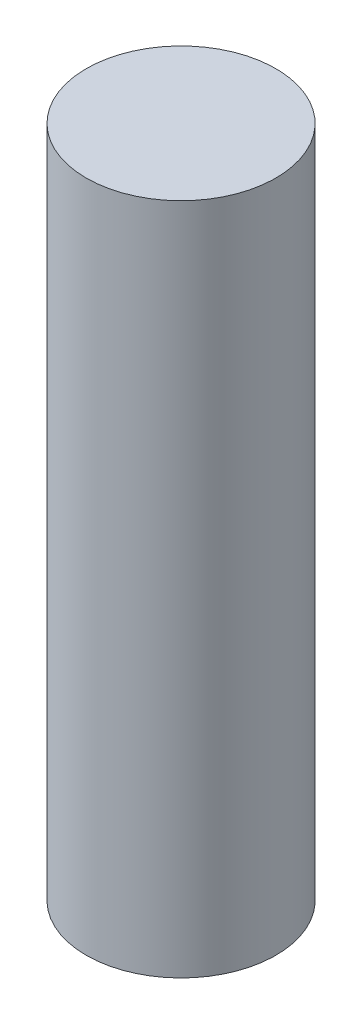
ISO-10303-21;
HEADER;
FILE_DESCRIPTION(('STEP AP214'),'2;1');
FILE_NAME('part.step','',(''),(''),'','','');
FILE_SCHEMA(('AUTOMOTIVE_DESIGN { 1 0 10303 214 1 1 1 1 }'));
ENDSEC;
DATA;
#1=APPLICATION_CONTEXT('core data for automotive mechanical design processes');
#2=APPLICATION_PROTOCOL_DEFINITION('international standard','automotive_design',2000,#1);
#3=PRODUCT_CONTEXT('',#1,'mechanical');
#4=PRODUCT('Part','Part','',(#3));
#5=PRODUCT_RELATED_PRODUCT_CATEGORY('part','',(#4));
#6=PRODUCT_DEFINITION_FORMATION('','',#4);
#7=PRODUCT_DEFINITION_CONTEXT('part definition',#1,'design');
#8=PRODUCT_DEFINITION('design','',#6,#7);
#9=PRODUCT_DEFINITION_SHAPE('','',#8);
#10=(LENGTH_UNIT() NAMED_UNIT(*) SI_UNIT(.MILLI.,.METRE.));
#11=(NAMED_UNIT(*) PLANE_ANGLE_UNIT() SI_UNIT($,.RADIAN.));
#12=(NAMED_UNIT(*) SI_UNIT($,.STERADIAN.) SOLID_ANGLE_UNIT());
#13=UNCERTAINTY_MEASURE_WITH_UNIT(LENGTH_MEASURE(1.E-05),#10,'distance_accuracy_value','');
#14=(GEOMETRIC_REPRESENTATION_CONTEXT(3) GLOBAL_UNCERTAINTY_ASSIGNED_CONTEXT((#13)) GLOBAL_UNIT_ASSIGNED_CONTEXT((#10,
#11,#12)) REPRESENTATION_CONTEXT('',''));
#15=CARTESIAN_POINT('',(0.,0.,0.));
#16=DIRECTION('',(0.,0.,1.));
#17=DIRECTION('',(1.,0.,0.));
#18=AXIS2_PLACEMENT_3D('',#15,#16,#17);
#19=CARTESIAN_POINT('',(0.,7.1,0.));
#20=DIRECTION('',(0.,-1.,0.));
#21=DIRECTION('',(0.,0.,-1.));
#22=AXIS2_PLACEMENT_3D('',#19,#20,#21);
#23=CYLINDRICAL_SURFACE('',#22,1.);
#24=CARTESIAN_POINT('',(0.,7.1,0.));
#25=DIRECTION('',(0.,1.,0.));
#26=DIRECTION('',(0.,0.,1.));
#27=AXIS2_PLACEMENT_3D('',#24,#25,#26);
#28=CIRCLE('',#27,1.);
#29=CARTESIAN_POINT('',(0.,7.1,1.));
#30=VERTEX_POINT('',#29);
#31=EDGE_CURVE('E10',#30,#30,#28,.T.);
#32=ORIENTED_EDGE('',*,*,#31,.F.);
#33=EDGE_LOOP('',(#32));
#34=FACE_BOUND('',#33,.T.);
#35=CARTESIAN_POINT('',(0.,0.,0.));
#36=DIRECTION('',(0.,1.,0.));
#37=DIRECTION('',(0.,0.,1.));
#38=AXIS2_PLACEMENT_3D('',#35,#36,#37);
#39=CIRCLE('',#38,1.);
#40=CARTESIAN_POINT('',(0.,0.,1.));
#41=VERTEX_POINT('',#40);
#42=EDGE_CURVE('E43',#41,#41,#39,.T.);
#43=ORIENTED_EDGE('',*,*,#42,.T.);
#44=EDGE_LOOP('',(#43));
#45=FACE_BOUND('',#44,.T.);
#46=ADVANCED_FACE('F40',(#34,#45),#23,.T.);
#47=CARTESIAN_POINT('',(0.,7.1,0.));
#48=DIRECTION('',(0.,1.,0.));
#49=DIRECTION('',(0.,0.,1.));
#50=AXIS2_PLACEMENT_3D('',#47,#48,#49);
#51=PLANE('',#50);
#52=ORIENTED_EDGE('',*,*,#31,.T.);
#53=EDGE_LOOP('',(#52));
#54=FACE_BOUND('',#53,.T.);
#55=ADVANCED_FACE('F57',(#54),#51,.T.);
#56=CARTESIAN_POINT('',(0.,0.,0.));
#57=DIRECTION('',(0.,1.,0.));
#58=DIRECTION('',(0.,0.,1.));
#59=AXIS2_PLACEMENT_3D('',#56,#57,#58);
#60=PLANE('',#59);
#61=ORIENTED_EDGE('',*,*,#42,.F.);
#62=EDGE_LOOP('',(#61));
#63=FACE_BOUND('',#62,.T.);
#64=ADVANCED_FACE('F55',(#63),#60,.F.);
#65=CLOSED_SHELL('',(#46,#55,#64));
#66=MANIFOLD_SOLID_BREP('B2',#65);
#67=ADVANCED_BREP_SHAPE_REPRESENTATION('',(#18,#66),#14);
#68=SHAPE_DEFINITION_REPRESENTATION(#9,#67);
ENDSEC;
END-ISO-10303-21;
